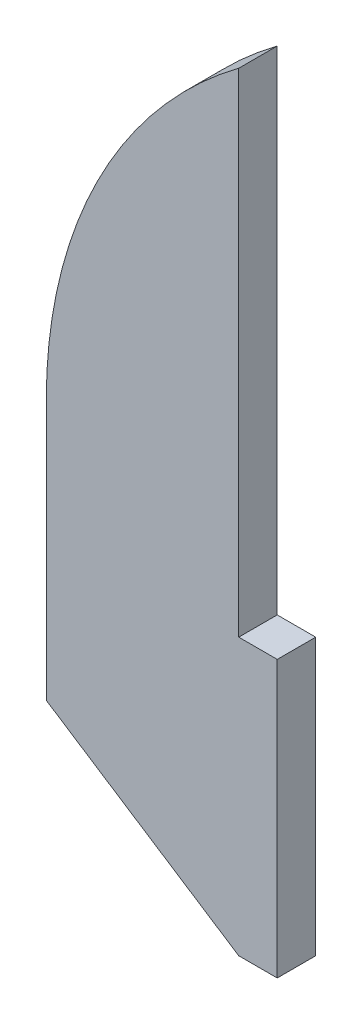
ISO-10303-21;
HEADER;
FILE_DESCRIPTION(('STEP AP214'),'2;1');
FILE_NAME('part.step','',(''),(''),'','','');
FILE_SCHEMA(('AUTOMOTIVE_DESIGN { 1 0 10303 214 1 1 1 1 }'));
ENDSEC;
DATA;
#1=APPLICATION_CONTEXT('core data for automotive mechanical design processes');
#2=APPLICATION_PROTOCOL_DEFINITION('international standard','automotive_design',2000,#1);
#3=PRODUCT_CONTEXT('',#1,'mechanical');
#4=PRODUCT('Part','Part','',(#3));
#5=PRODUCT_RELATED_PRODUCT_CATEGORY('part','',(#4));
#6=PRODUCT_DEFINITION_FORMATION('','',#4);
#7=PRODUCT_DEFINITION_CONTEXT('part definition',#1,'design');
#8=PRODUCT_DEFINITION('design','',#6,#7);
#9=PRODUCT_DEFINITION_SHAPE('','',#8);
#10=(LENGTH_UNIT() NAMED_UNIT(*) SI_UNIT(.MILLI.,.METRE.));
#11=(NAMED_UNIT(*) PLANE_ANGLE_UNIT() SI_UNIT($,.RADIAN.));
#12=(NAMED_UNIT(*) SI_UNIT($,.STERADIAN.) SOLID_ANGLE_UNIT());
#13=UNCERTAINTY_MEASURE_WITH_UNIT(LENGTH_MEASURE(1.E-05),#10,'distance_accuracy_value','');
#14=(GEOMETRIC_REPRESENTATION_CONTEXT(3) GLOBAL_UNCERTAINTY_ASSIGNED_CONTEXT((#13)) GLOBAL_UNIT_ASSIGNED_CONTEXT((#10,
#11,#12)) REPRESENTATION_CONTEXT('',''));
#15=CARTESIAN_POINT('',(0.,0.,0.));
#16=DIRECTION('',(0.,0.,1.));
#17=DIRECTION('',(1.,0.,0.));
#18=AXIS2_PLACEMENT_3D('',#15,#16,#17);
#19=CARTESIAN_POINT('',(49.6870443436671,5.00000000000001,5.));
#20=DIRECTION('',(0.,0.,-1.));
#21=DIRECTION('',(-1.,0.,0.));
#22=AXIS2_PLACEMENT_3D('',#19,#20,#21);
#23=CYLINDRICAL_SURFACE('',#22,62.1870443436671);
#24=CARTESIAN_POINT('',(49.6870443436671,5.00000000000001,0.));
#25=DIRECTION('',(0.,0.,1.));
#26=DIRECTION('',(1.,0.,0.));
#27=AXIS2_PLACEMENT_3D('',#24,#25,#26);
#28=CIRCLE('',#27,62.1870443436671);
#29=CARTESIAN_POINT('',(12.5,54.843276549434,0.));
#30=VERTEX_POINT('',#29);
#31=CARTESIAN_POINT('',(-12.5,5.,0.));
#32=VERTEX_POINT('',#31);
#33=EDGE_CURVE('E122',#30,#32,#28,.T.);
#34=ORIENTED_EDGE('',*,*,#33,.T.);
#35=DIRECTION('',(0.,0.,-1.));
#36=VECTOR('',#35,1.);
#37=CARTESIAN_POINT('',(-12.5,5.,5.));
#38=LINE('',#37,#36);
#39=CARTESIAN_POINT('',(-12.5,5.,5.));
#40=VERTEX_POINT('',#39);
#41=EDGE_CURVE('E11',#40,#32,#38,.T.);
#42=ORIENTED_EDGE('',*,*,#41,.F.);
#43=CARTESIAN_POINT('',(49.6870443436671,5.00000000000001,5.));
#44=DIRECTION('',(0.,0.,1.));
#45=DIRECTION('',(1.,0.,0.));
#46=AXIS2_PLACEMENT_3D('',#43,#44,#45);
#47=CIRCLE('',#46,62.1870443436671);
#48=CARTESIAN_POINT('',(12.5,54.843276549434,5.));
#49=VERTEX_POINT('',#48);
#50=EDGE_CURVE('E82',#49,#40,#47,.T.);
#51=ORIENTED_EDGE('',*,*,#50,.F.);
#52=DIRECTION('',(0.,0.,-1.));
#53=VECTOR('',#52,1.);
#54=CARTESIAN_POINT('',(12.5,54.843276549434,5.));
#55=LINE('',#54,#53);
#56=EDGE_CURVE('E118',#49,#30,#55,.T.);
#57=ORIENTED_EDGE('',*,*,#56,.T.);
#58=EDGE_LOOP('',(#34,#42,#51,#57));
#59=FACE_BOUND('',#58,.T.);
#60=ADVANCED_FACE('F33',(#59),#23,.T.);
#61=CARTESIAN_POINT('',(-12.5,-131.952918912305,5.));
#62=DIRECTION('',(-1.,0.,0.));
#63=DIRECTION('',(0.,-1.,0.));
#64=AXIS2_PLACEMENT_3D('',#61,#62,#63);
#65=PLANE('',#64);
#66=DIRECTION('',(0.,1.,0.));
#67=VECTOR('',#66,1.);
#68=CARTESIAN_POINT('',(-12.5,-131.952918912305,0.));
#69=LINE('',#68,#67);
#70=CARTESIAN_POINT('',(-12.5,-28.7648101700622,0.));
#71=VERTEX_POINT('',#70);
#72=EDGE_CURVE('E125',#71,#32,#69,.T.);
#73=ORIENTED_EDGE('',*,*,#72,.F.);
#74=DIRECTION('',(0.,0.,-1.));
#75=VECTOR('',#74,1.);
#76=CARTESIAN_POINT('',(-12.5,-28.7648101700622,5.));
#77=LINE('',#76,#75);
#78=CARTESIAN_POINT('',(-12.5,-28.7648101700622,5.));
#79=VERTEX_POINT('',#78);
#80=EDGE_CURVE('E41',#79,#71,#77,.T.);
#81=ORIENTED_EDGE('',*,*,#80,.F.);
#82=DIRECTION('',(0.,1.,0.));
#83=VECTOR('',#82,1.);
#84=CARTESIAN_POINT('',(-12.5,-131.952918912305,5.));
#85=LINE('',#84,#83);
#86=EDGE_CURVE('E156',#79,#40,#85,.T.);
#87=ORIENTED_EDGE('',*,*,#86,.T.);
#88=ORIENTED_EDGE('',*,*,#41,.T.);
#89=EDGE_LOOP('',(#73,#81,#87,#88));
#90=FACE_BOUND('',#89,.T.);
#91=ADVANCED_FACE('F149',(#90),#65,.T.);
#92=CARTESIAN_POINT('',(78.3739110135113,-87.7790180057915,5.));
#93=DIRECTION('',(-0.544639035015028,-0.838670567945423,0.));
#94=DIRECTION('',(0.838670567945423,-0.544639035015028,0.));
#95=AXIS2_PLACEMENT_3D('',#92,#93,#94);
#96=PLANE('',#95);
#97=DIRECTION('',(-0.838670567945423,0.544639035015028,0.));
#98=VECTOR('',#97,1.);
#99=CARTESIAN_POINT('',(78.3739110135113,-87.7790180057915,0.));
#100=LINE('',#99,#98);
#101=CARTESIAN_POINT('',(12.5,-45.,0.));
#102=VERTEX_POINT('',#101);
#103=EDGE_CURVE('E128',#102,#71,#100,.T.);
#104=ORIENTED_EDGE('',*,*,#103,.F.);
#105=DIRECTION('',(0.,0.,-1.));
#106=VECTOR('',#105,1.);
#107=CARTESIAN_POINT('',(12.5,-45.,5.));
#108=LINE('',#107,#106);
#109=CARTESIAN_POINT('',(12.5,-45.,5.));
#110=VERTEX_POINT('',#109);
#111=EDGE_CURVE('E140',#110,#102,#108,.T.);
#112=ORIENTED_EDGE('',*,*,#111,.F.);
#113=DIRECTION('',(-0.838670567945423,0.544639035015028,0.));
#114=VECTOR('',#113,1.);
#115=CARTESIAN_POINT('',(78.3739110135113,-87.7790180057915,5.));
#116=LINE('',#115,#114);
#117=EDGE_CURVE('E146',#110,#79,#116,.T.);
#118=ORIENTED_EDGE('',*,*,#117,.T.);
#119=ORIENTED_EDGE('',*,*,#80,.T.);
#120=EDGE_LOOP('',(#104,#112,#118,#119));
#121=FACE_BOUND('',#120,.T.);
#122=ADVANCED_FACE('F145',(#121),#96,.T.);
#123=CARTESIAN_POINT('',(49.6870443436673,-45.0000000000001,5.));
#124=DIRECTION('',(0.,1.,0.));
#125=DIRECTION('',(-1.,0.,0.));
#126=AXIS2_PLACEMENT_3D('',#123,#124,#125);
#127=PLANE('',#126);
#128=DIRECTION('',(1.,0.,0.));
#129=VECTOR('',#128,1.);
#130=CARTESIAN_POINT('',(49.6870443436673,-45.0000000000001,0.));
#131=LINE('',#130,#129);
#132=CARTESIAN_POINT('',(17.5,-45.,0.));
#133=VERTEX_POINT('',#132);
#134=EDGE_CURVE('E131',#102,#133,#131,.T.);
#135=ORIENTED_EDGE('',*,*,#134,.T.);
#136=DIRECTION('',(0.,0.,-1.));
#137=VECTOR('',#136,1.);
#138=CARTESIAN_POINT('',(17.5,-45.,5.));
#139=LINE('',#138,#137);
#140=CARTESIAN_POINT('',(17.5,-45.,5.));
#141=VERTEX_POINT('',#140);
#142=EDGE_CURVE('E114',#141,#133,#139,.T.);
#143=ORIENTED_EDGE('',*,*,#142,.F.);
#144=DIRECTION('',(1.,0.,0.));
#145=VECTOR('',#144,1.);
#146=CARTESIAN_POINT('',(49.6870443436673,-45.0000000000001,5.));
#147=LINE('',#146,#145);
#148=EDGE_CURVE('E101',#110,#141,#147,.T.);
#149=ORIENTED_EDGE('',*,*,#148,.F.);
#150=ORIENTED_EDGE('',*,*,#111,.T.);
#151=EDGE_LOOP('',(#135,#143,#149,#150));
#152=FACE_BOUND('',#151,.T.);
#153=ADVANCED_FACE('F155',(#152),#127,.F.);
#154=CARTESIAN_POINT('',(17.5000000000001,-131.952918912305,5.));
#155=DIRECTION('',(-1.,0.,0.));
#156=DIRECTION('',(0.,-1.,0.));
#157=AXIS2_PLACEMENT_3D('',#154,#155,#156);
#158=PLANE('',#157);
#159=DIRECTION('',(0.,1.,0.));
#160=VECTOR('',#159,1.);
#161=CARTESIAN_POINT('',(17.5000000000001,-131.952918912305,0.));
#162=LINE('',#161,#160);
#163=CARTESIAN_POINT('',(17.5,-9.15672345056603,0.));
#164=VERTEX_POINT('',#163);
#165=EDGE_CURVE('E110',#133,#164,#162,.T.);
#166=ORIENTED_EDGE('',*,*,#165,.T.);
#167=DIRECTION('',(0.,0.,-1.));
#168=VECTOR('',#167,1.);
#169=CARTESIAN_POINT('',(17.5,-9.15672345056603,5.));
#170=LINE('',#169,#168);
#171=CARTESIAN_POINT('',(17.5,-9.15672345056603,5.));
#172=VERTEX_POINT('',#171);
#173=EDGE_CURVE('E107',#172,#164,#170,.T.);
#174=ORIENTED_EDGE('',*,*,#173,.F.);
#175=DIRECTION('',(0.,1.,0.));
#176=VECTOR('',#175,1.);
#177=CARTESIAN_POINT('',(17.5000000000001,-131.952918912305,5.));
#178=LINE('',#177,#176);
#179=EDGE_CURVE('E94',#141,#172,#178,.T.);
#180=ORIENTED_EDGE('',*,*,#179,.F.);
#181=ORIENTED_EDGE('',*,*,#142,.T.);
#182=EDGE_LOOP('',(#166,#174,#180,#181));
#183=FACE_BOUND('',#182,.T.);
#184=ADVANCED_FACE('F108',(#183),#158,.F.);
#185=CARTESIAN_POINT('',(49.6870443436671,-9.15672345056603,5.));
#186=DIRECTION('',(0.,1.,0.));
#187=DIRECTION('',(0.,0.,1.));
#188=AXIS2_PLACEMENT_3D('',#185,#186,#187);
#189=PLANE('',#188);
#190=DIRECTION('',(1.,0.,0.));
#191=VECTOR('',#190,1.);
#192=CARTESIAN_POINT('',(49.6870443436671,-9.15672345056603,0.));
#193=LINE('',#192,#191);
#194=CARTESIAN_POINT('',(12.5,-9.15672345056603,0.));
#195=VERTEX_POINT('',#194);
#196=EDGE_CURVE('E134',#195,#164,#193,.T.);
#197=ORIENTED_EDGE('',*,*,#196,.F.);
#198=DIRECTION('',(0.,0.,-1.));
#199=VECTOR('',#198,1.);
#200=CARTESIAN_POINT('',(12.5,-9.15672345056603,5.));
#201=LINE('',#200,#199);
#202=CARTESIAN_POINT('',(12.5,-9.15672345056603,5.));
#203=VERTEX_POINT('',#202);
#204=EDGE_CURVE('E73',#203,#195,#201,.T.);
#205=ORIENTED_EDGE('',*,*,#204,.F.);
#206=DIRECTION('',(1.,0.,0.));
#207=VECTOR('',#206,1.);
#208=CARTESIAN_POINT('',(49.6870443436671,-9.15672345056603,5.));
#209=LINE('',#208,#207);
#210=EDGE_CURVE('E98',#203,#172,#209,.T.);
#211=ORIENTED_EDGE('',*,*,#210,.T.);
#212=ORIENTED_EDGE('',*,*,#173,.T.);
#213=EDGE_LOOP('',(#197,#205,#211,#212));
#214=FACE_BOUND('',#213,.T.);
#215=ADVANCED_FACE('F116',(#214),#189,.T.);
#216=CARTESIAN_POINT('',(12.5,-131.952918912305,5.));
#217=DIRECTION('',(-1.,0.,0.));
#218=DIRECTION('',(0.,-1.,0.));
#219=AXIS2_PLACEMENT_3D('',#216,#217,#218);
#220=PLANE('',#219);
#221=DIRECTION('',(0.,1.,0.));
#222=VECTOR('',#221,1.);
#223=CARTESIAN_POINT('',(12.5,-131.952918912305,0.));
#224=LINE('',#223,#222);
#225=EDGE_CURVE('E76',#195,#30,#224,.T.);
#226=ORIENTED_EDGE('',*,*,#225,.T.);
#227=ORIENTED_EDGE('',*,*,#56,.F.);
#228=DIRECTION('',(0.,1.,0.));
#229=VECTOR('',#228,1.);
#230=CARTESIAN_POINT('',(12.5,-131.952918912305,5.));
#231=LINE('',#230,#229);
#232=EDGE_CURVE('E49',#203,#49,#231,.T.);
#233=ORIENTED_EDGE('',*,*,#232,.F.);
#234=ORIENTED_EDGE('',*,*,#204,.T.);
#235=EDGE_LOOP('',(#226,#227,#233,#234));
#236=FACE_BOUND('',#235,.T.);
#237=ADVANCED_FACE('F173',(#236),#220,.F.);
#238=CARTESIAN_POINT('',(49.6870443436671,-131.952918912305,5.));
#239=DIRECTION('',(0.,0.,1.));
#240=DIRECTION('',(1.,0.,0.));
#241=AXIS2_PLACEMENT_3D('',#238,#239,#240);
#242=PLANE('',#241);
#243=ORIENTED_EDGE('',*,*,#50,.T.);
#244=ORIENTED_EDGE('',*,*,#86,.F.);
#245=ORIENTED_EDGE('',*,*,#117,.F.);
#246=ORIENTED_EDGE('',*,*,#148,.T.);
#247=ORIENTED_EDGE('',*,*,#179,.T.);
#248=ORIENTED_EDGE('',*,*,#210,.F.);
#249=ORIENTED_EDGE('',*,*,#232,.T.);
#250=EDGE_LOOP('',(#243,#244,#245,#246,#247,#248,#249));
#251=FACE_BOUND('',#250,.T.);
#252=ADVANCED_FACE('F96',(#251),#242,.T.);
#253=CARTESIAN_POINT('',(49.6870443436671,-131.952918912305,0.));
#254=DIRECTION('',(0.,0.,1.));
#255=DIRECTION('',(1.,0.,0.));
#256=AXIS2_PLACEMENT_3D('',#253,#254,#255);
#257=PLANE('',#256);
#258=ORIENTED_EDGE('',*,*,#33,.F.);
#259=ORIENTED_EDGE('',*,*,#225,.F.);
#260=ORIENTED_EDGE('',*,*,#196,.T.);
#261=ORIENTED_EDGE('',*,*,#165,.F.);
#262=ORIENTED_EDGE('',*,*,#134,.F.);
#263=ORIENTED_EDGE('',*,*,#103,.T.);
#264=ORIENTED_EDGE('',*,*,#72,.T.);
#265=EDGE_LOOP('',(#258,#259,#260,#261,#262,#263,#264));
#266=FACE_BOUND('',#265,.T.);
#267=ADVANCED_FACE('F153',(#266),#257,.F.);
#268=CLOSED_SHELL('',(#60,#91,#122,#153,#184,#215,#237,#252,#267));
#269=MANIFOLD_SOLID_BREP('B2',#268);
#270=ADVANCED_BREP_SHAPE_REPRESENTATION('',(#18,#269),#14);
#271=SHAPE_DEFINITION_REPRESENTATION(#9,#270);
ENDSEC;
END-ISO-10303-21;
